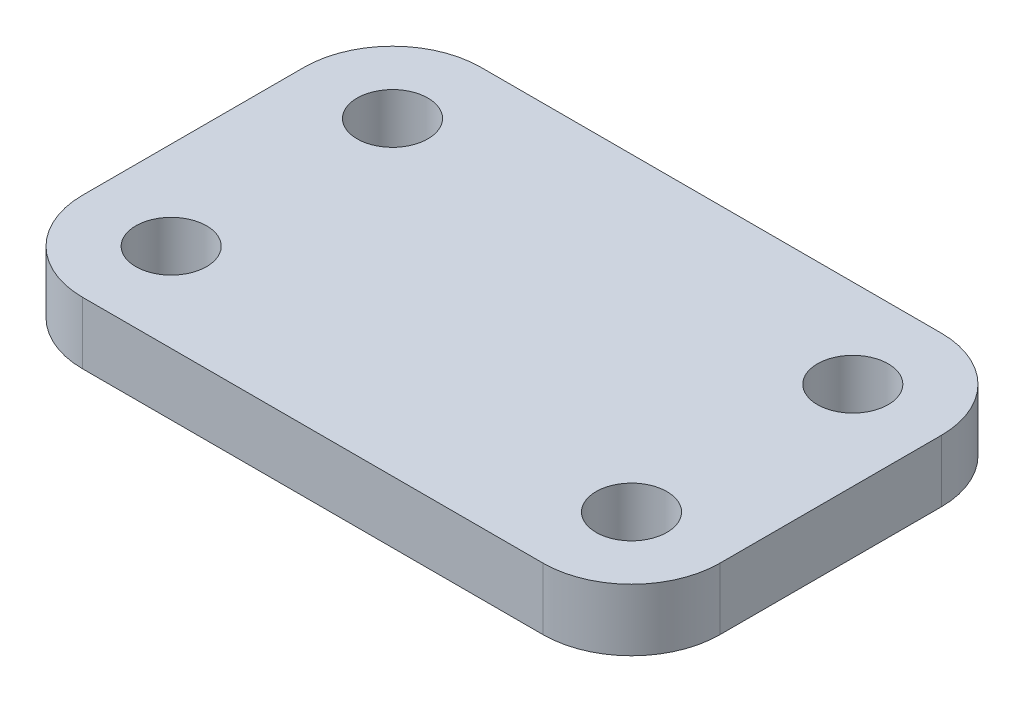
ISO-10303-21;
HEADER;
FILE_DESCRIPTION(('STEP AP214'),'2;1');
FILE_NAME('part.step','',(''),(''),'','','');
FILE_SCHEMA(('AUTOMOTIVE_DESIGN { 1 0 10303 214 1 1 1 1 }'));
ENDSEC;
DATA;
#1=APPLICATION_CONTEXT('core data for automotive mechanical design processes');
#2=APPLICATION_PROTOCOL_DEFINITION('international standard','automotive_design',2000,#1);
#3=PRODUCT_CONTEXT('',#1,'mechanical');
#4=PRODUCT('Part','Part','',(#3));
#5=PRODUCT_RELATED_PRODUCT_CATEGORY('part','',(#4));
#6=PRODUCT_DEFINITION_FORMATION('','',#4);
#7=PRODUCT_DEFINITION_CONTEXT('part definition',#1,'design');
#8=PRODUCT_DEFINITION('design','',#6,#7);
#9=PRODUCT_DEFINITION_SHAPE('','',#8);
#10=(LENGTH_UNIT() NAMED_UNIT(*) SI_UNIT(.MILLI.,.METRE.));
#11=(NAMED_UNIT(*) PLANE_ANGLE_UNIT() SI_UNIT($,.RADIAN.));
#12=(NAMED_UNIT(*) SI_UNIT($,.STERADIAN.) SOLID_ANGLE_UNIT());
#13=UNCERTAINTY_MEASURE_WITH_UNIT(LENGTH_MEASURE(1.E-05),#10,'distance_accuracy_value','');
#14=(GEOMETRIC_REPRESENTATION_CONTEXT(3) GLOBAL_UNCERTAINTY_ASSIGNED_CONTEXT((#13)) GLOBAL_UNIT_ASSIGNED_CONTEXT((#10,
#11,#12)) REPRESENTATION_CONTEXT('',''));
#15=CARTESIAN_POINT('',(0.,0.,0.));
#16=DIRECTION('',(0.,0.,1.));
#17=DIRECTION('',(1.,0.,0.));
#18=AXIS2_PLACEMENT_3D('',#15,#16,#17);
#19=CARTESIAN_POINT('',(36.,7.,-22.5));
#20=DIRECTION('',(-1.,0.,0.));
#21=DIRECTION('',(0.,0.,1.));
#22=AXIS2_PLACEMENT_3D('',#19,#20,#21);
#23=PLANE('',#22);
#24=DIRECTION('',(0.,0.,-1.));
#25=VECTOR('',#24,1.);
#26=CARTESIAN_POINT('',(36.,0.,-22.5));
#27=LINE('',#26,#25);
#28=CARTESIAN_POINT('',(36.,0.,12.5));
#29=VERTEX_POINT('',#28);
#30=CARTESIAN_POINT('',(36.,0.,-12.5));
#31=VERTEX_POINT('',#30);
#32=EDGE_CURVE('E119',#29,#31,#27,.T.);
#33=ORIENTED_EDGE('',*,*,#32,.T.);
#34=DIRECTION('',(0.,-1.,0.));
#35=VECTOR('',#34,1.);
#36=CARTESIAN_POINT('',(36.,7.,-12.5));
#37=LINE('',#36,#35);
#38=CARTESIAN_POINT('',(36.,7.,-12.5));
#39=VERTEX_POINT('',#38);
#40=EDGE_CURVE('E11',#31,#39,#37,.F.);
#41=ORIENTED_EDGE('',*,*,#40,.T.);
#42=DIRECTION('',(0.,0.,-1.));
#43=VECTOR('',#42,1.);
#44=CARTESIAN_POINT('',(36.,7.,-22.5));
#45=LINE('',#44,#43);
#46=CARTESIAN_POINT('',(36.,7.,12.5));
#47=VERTEX_POINT('',#46);
#48=EDGE_CURVE('E120',#47,#39,#45,.T.);
#49=ORIENTED_EDGE('',*,*,#48,.F.);
#50=DIRECTION('',(0.,-1.,0.));
#51=VECTOR('',#50,1.);
#52=CARTESIAN_POINT('',(36.,7.,12.5));
#53=LINE('',#52,#51);
#54=EDGE_CURVE('E111',#47,#29,#53,.T.);
#55=ORIENTED_EDGE('',*,*,#54,.T.);
#56=EDGE_LOOP('',(#33,#41,#49,#55));
#57=FACE_BOUND('',#56,.T.);
#58=ADVANCED_FACE('F39',(#57),#23,.F.);
#59=CARTESIAN_POINT('',(-36.,7.,-22.5));
#60=DIRECTION('',(0.,0.,1.));
#61=DIRECTION('',(1.,0.,0.));
#62=AXIS2_PLACEMENT_3D('',#59,#60,#61);
#63=PLANE('',#62);
#64=DIRECTION('',(-1.,0.,0.));
#65=VECTOR('',#64,1.);
#66=CARTESIAN_POINT('',(-36.,0.,-22.5));
#67=LINE('',#66,#65);
#68=CARTESIAN_POINT('',(26.,0.,-22.5));
#69=VERTEX_POINT('',#68);
#70=CARTESIAN_POINT('',(-26.,0.,-22.5));
#71=VERTEX_POINT('',#70);
#72=EDGE_CURVE('E129',#69,#71,#67,.T.);
#73=ORIENTED_EDGE('',*,*,#72,.T.);
#74=DIRECTION('',(0.,-1.,0.));
#75=VECTOR('',#74,1.);
#76=CARTESIAN_POINT('',(-26.,7.,-22.5));
#77=LINE('',#76,#75);
#78=CARTESIAN_POINT('',(-26.,7.,-22.5));
#79=VERTEX_POINT('',#78);
#80=EDGE_CURVE('E173',#71,#79,#77,.F.);
#81=ORIENTED_EDGE('',*,*,#80,.T.);
#82=DIRECTION('',(-1.,0.,0.));
#83=VECTOR('',#82,1.);
#84=CARTESIAN_POINT('',(-36.,7.,-22.5));
#85=LINE('',#84,#83);
#86=CARTESIAN_POINT('',(26.,7.,-22.5));
#87=VERTEX_POINT('',#86);
#88=EDGE_CURVE('E315',#87,#79,#85,.T.);
#89=ORIENTED_EDGE('',*,*,#88,.F.);
#90=DIRECTION('',(0.,-1.,0.));
#91=VECTOR('',#90,1.);
#92=CARTESIAN_POINT('',(26.,7.,-22.5));
#93=LINE('',#92,#91);
#94=EDGE_CURVE('E169',#87,#69,#93,.T.);
#95=ORIENTED_EDGE('',*,*,#94,.T.);
#96=EDGE_LOOP('',(#73,#81,#89,#95));
#97=FACE_BOUND('',#96,.T.);
#98=ADVANCED_FACE('F206',(#97),#63,.F.);
#99=CARTESIAN_POINT('',(-36.,7.,-22.5));
#100=DIRECTION('',(1.,0.,0.));
#101=DIRECTION('',(0.,0.,-1.));
#102=AXIS2_PLACEMENT_3D('',#99,#100,#101);
#103=PLANE('',#102);
#104=DIRECTION('',(0.,0.,1.));
#105=VECTOR('',#104,1.);
#106=CARTESIAN_POINT('',(-36.,7.,-22.5));
#107=LINE('',#106,#105);
#108=CARTESIAN_POINT('',(-36.,7.,-12.5));
#109=VERTEX_POINT('',#108);
#110=CARTESIAN_POINT('',(-36.,7.,12.5));
#111=VERTEX_POINT('',#110);
#112=EDGE_CURVE('E318',#109,#111,#107,.T.);
#113=ORIENTED_EDGE('',*,*,#112,.F.);
#114=DIRECTION('',(0.,-1.,0.));
#115=VECTOR('',#114,1.);
#116=CARTESIAN_POINT('',(-36.,7.,-12.5));
#117=LINE('',#116,#115);
#118=CARTESIAN_POINT('',(-36.,0.,-12.5));
#119=VERTEX_POINT('',#118);
#120=EDGE_CURVE('E157',#109,#119,#117,.T.);
#121=ORIENTED_EDGE('',*,*,#120,.T.);
#122=DIRECTION('',(0.,0.,1.));
#123=VECTOR('',#122,1.);
#124=CARTESIAN_POINT('',(-36.,0.,-22.5));
#125=LINE('',#124,#123);
#126=CARTESIAN_POINT('',(-36.,0.,12.5));
#127=VERTEX_POINT('',#126);
#128=EDGE_CURVE('E135',#119,#127,#125,.T.);
#129=ORIENTED_EDGE('',*,*,#128,.T.);
#130=DIRECTION('',(0.,-1.,0.));
#131=VECTOR('',#130,1.);
#132=CARTESIAN_POINT('',(-36.,7.,12.5));
#133=LINE('',#132,#131);
#134=EDGE_CURVE('E154',#127,#111,#133,.F.);
#135=ORIENTED_EDGE('',*,*,#134,.T.);
#136=EDGE_LOOP('',(#113,#121,#129,#135));
#137=FACE_BOUND('',#136,.T.);
#138=ADVANCED_FACE('F192',(#137),#103,.F.);
#139=CARTESIAN_POINT('',(-36.,7.,22.5));
#140=DIRECTION('',(0.,0.,-1.));
#141=DIRECTION('',(-1.,0.,0.));
#142=AXIS2_PLACEMENT_3D('',#139,#140,#141);
#143=PLANE('',#142);
#144=DIRECTION('',(1.,0.,0.));
#145=VECTOR('',#144,1.);
#146=CARTESIAN_POINT('',(-36.,7.,22.5));
#147=LINE('',#146,#145);
#148=CARTESIAN_POINT('',(-26.,7.,22.5));
#149=VERTEX_POINT('',#148);
#150=CARTESIAN_POINT('',(26.,7.,22.5));
#151=VERTEX_POINT('',#150);
#152=EDGE_CURVE('E122',#149,#151,#147,.T.);
#153=ORIENTED_EDGE('',*,*,#152,.F.);
#154=DIRECTION('',(0.,-1.,0.));
#155=VECTOR('',#154,1.);
#156=CARTESIAN_POINT('',(-26.,7.,22.5));
#157=LINE('',#156,#155);
#158=CARTESIAN_POINT('',(-26.,0.,22.5));
#159=VERTEX_POINT('',#158);
#160=EDGE_CURVE('E48',#149,#159,#157,.T.);
#161=ORIENTED_EDGE('',*,*,#160,.T.);
#162=DIRECTION('',(1.,0.,0.));
#163=VECTOR('',#162,1.);
#164=CARTESIAN_POINT('',(-36.,0.,22.5));
#165=LINE('',#164,#163);
#166=CARTESIAN_POINT('',(26.,0.,22.5));
#167=VERTEX_POINT('',#166);
#168=EDGE_CURVE('E146',#159,#167,#165,.T.);
#169=ORIENTED_EDGE('',*,*,#168,.T.);
#170=DIRECTION('',(0.,-1.,0.));
#171=VECTOR('',#170,1.);
#172=CARTESIAN_POINT('',(26.,7.,22.5));
#173=LINE('',#172,#171);
#174=EDGE_CURVE('E113',#167,#151,#173,.F.);
#175=ORIENTED_EDGE('',*,*,#174,.T.);
#176=EDGE_LOOP('',(#153,#161,#169,#175));
#177=FACE_BOUND('',#176,.T.);
#178=ADVANCED_FACE('F187',(#177),#143,.F.);
#179=CARTESIAN_POINT('',(0.,7.,0.));
#180=DIRECTION('',(0.,1.,0.));
#181=DIRECTION('',(0.,0.,1.));
#182=AXIS2_PLACEMENT_3D('',#179,#180,#181);
#183=PLANE('',#182);
#184=CARTESIAN_POINT('',(26.,7.,-12.5));
#185=DIRECTION('',(0.,1.,0.));
#186=DIRECTION('',(0.,0.,1.));
#187=AXIS2_PLACEMENT_3D('',#184,#185,#186);
#188=CIRCLE('',#187,4.);
#189=CARTESIAN_POINT('',(26.,7.,-8.5));
#190=VERTEX_POINT('',#189);
#191=EDGE_CURVE('E301',#190,#190,#188,.T.);
#192=ORIENTED_EDGE('',*,*,#191,.F.);
#193=EDGE_LOOP('',(#192));
#194=FACE_BOUND('',#193,.T.);
#195=CARTESIAN_POINT('',(-26.,7.,12.5));
#196=DIRECTION('',(0.,1.,0.));
#197=DIRECTION('',(0.,0.,1.));
#198=AXIS2_PLACEMENT_3D('',#195,#196,#197);
#199=CIRCLE('',#198,4.);
#200=CARTESIAN_POINT('',(-26.,7.,16.5));
#201=VERTEX_POINT('',#200);
#202=EDGE_CURVE('E305',#201,#201,#199,.T.);
#203=ORIENTED_EDGE('',*,*,#202,.F.);
#204=EDGE_LOOP('',(#203));
#205=FACE_BOUND('',#204,.T.);
#206=CARTESIAN_POINT('',(26.,7.,12.5));
#207=DIRECTION('',(0.,1.,0.));
#208=DIRECTION('',(0.,0.,1.));
#209=AXIS2_PLACEMENT_3D('',#206,#207,#208);
#210=CIRCLE('',#209,4.);
#211=CARTESIAN_POINT('',(26.,7.,16.5));
#212=VERTEX_POINT('',#211);
#213=EDGE_CURVE('E330',#212,#212,#210,.T.);
#214=ORIENTED_EDGE('',*,*,#213,.F.);
#215=EDGE_LOOP('',(#214));
#216=FACE_BOUND('',#215,.T.);
#217=CARTESIAN_POINT('',(-26.,7.,-12.5));
#218=DIRECTION('',(0.,1.,0.));
#219=DIRECTION('',(0.,0.,1.));
#220=AXIS2_PLACEMENT_3D('',#217,#218,#219);
#221=CIRCLE('',#220,4.);
#222=CARTESIAN_POINT('',(-26.,7.,-8.5));
#223=VERTEX_POINT('',#222);
#224=EDGE_CURVE('E138',#223,#223,#221,.T.);
#225=ORIENTED_EDGE('',*,*,#224,.F.);
#226=EDGE_LOOP('',(#225));
#227=FACE_BOUND('',#226,.T.);
#228=ORIENTED_EDGE('',*,*,#88,.T.);
#229=CARTESIAN_POINT('',(-26.,7.,-12.5));
#230=DIRECTION('',(0.,1.,0.));
#231=DIRECTION('',(0.,0.,1.));
#232=AXIS2_PLACEMENT_3D('',#229,#230,#231);
#233=CIRCLE('',#232,10.);
#234=EDGE_CURVE('E181',#79,#109,#233,.T.);
#235=ORIENTED_EDGE('',*,*,#234,.T.);
#236=ORIENTED_EDGE('',*,*,#112,.T.);
#237=CARTESIAN_POINT('',(-26.,7.,12.5));
#238=DIRECTION('',(0.,1.,0.));
#239=DIRECTION('',(0.,0.,1.));
#240=AXIS2_PLACEMENT_3D('',#237,#238,#239);
#241=CIRCLE('',#240,10.);
#242=EDGE_CURVE('E61',#111,#149,#241,.T.);
#243=ORIENTED_EDGE('',*,*,#242,.T.);
#244=ORIENTED_EDGE('',*,*,#152,.T.);
#245=CARTESIAN_POINT('',(26.,7.,12.5));
#246=DIRECTION('',(0.,1.,0.));
#247=DIRECTION('',(0.,0.,1.));
#248=AXIS2_PLACEMENT_3D('',#245,#246,#247);
#249=CIRCLE('',#248,10.);
#250=EDGE_CURVE('E151',#151,#47,#249,.T.);
#251=ORIENTED_EDGE('',*,*,#250,.T.);
#252=ORIENTED_EDGE('',*,*,#48,.T.);
#253=CARTESIAN_POINT('',(26.,7.,-12.5));
#254=DIRECTION('',(0.,1.,0.));
#255=DIRECTION('',(0.,0.,1.));
#256=AXIS2_PLACEMENT_3D('',#253,#254,#255);
#257=CIRCLE('',#256,10.);
#258=EDGE_CURVE('E176',#39,#87,#257,.T.);
#259=ORIENTED_EDGE('',*,*,#258,.T.);
#260=EDGE_LOOP('',(#228,#235,#236,#243,#244,#251,#252,#259));
#261=FACE_BOUND('',#260,.T.);
#262=ADVANCED_FACE('F219',(#194,#205,#216,#227,#261),#183,.T.);
#263=CARTESIAN_POINT('',(0.,0.,0.));
#264=DIRECTION('',(0.,1.,0.));
#265=DIRECTION('',(0.,0.,1.));
#266=AXIS2_PLACEMENT_3D('',#263,#264,#265);
#267=PLANE('',#266);
#268=CARTESIAN_POINT('',(26.,0.,-12.5));
#269=DIRECTION('',(0.,1.,0.));
#270=DIRECTION('',(0.,0.,1.));
#271=AXIS2_PLACEMENT_3D('',#268,#269,#270);
#272=CIRCLE('',#271,4.);
#273=CARTESIAN_POINT('',(26.,0.,-8.5));
#274=VERTEX_POINT('',#273);
#275=EDGE_CURVE('E298',#274,#274,#272,.T.);
#276=ORIENTED_EDGE('',*,*,#275,.T.);
#277=EDGE_LOOP('',(#276));
#278=FACE_BOUND('',#277,.T.);
#279=CARTESIAN_POINT('',(-26.,0.,12.5));
#280=DIRECTION('',(0.,1.,0.));
#281=DIRECTION('',(0.,0.,1.));
#282=AXIS2_PLACEMENT_3D('',#279,#280,#281);
#283=CIRCLE('',#282,4.);
#284=CARTESIAN_POINT('',(-26.,0.,16.5));
#285=VERTEX_POINT('',#284);
#286=EDGE_CURVE('E336',#285,#285,#283,.T.);
#287=ORIENTED_EDGE('',*,*,#286,.T.);
#288=EDGE_LOOP('',(#287));
#289=FACE_BOUND('',#288,.T.);
#290=CARTESIAN_POINT('',(26.,0.,12.5));
#291=DIRECTION('',(0.,1.,0.));
#292=DIRECTION('',(0.,0.,1.));
#293=AXIS2_PLACEMENT_3D('',#290,#291,#292);
#294=CIRCLE('',#293,4.);
#295=CARTESIAN_POINT('',(26.,0.,16.5));
#296=VERTEX_POINT('',#295);
#297=EDGE_CURVE('E312',#296,#296,#294,.T.);
#298=ORIENTED_EDGE('',*,*,#297,.T.);
#299=EDGE_LOOP('',(#298));
#300=FACE_BOUND('',#299,.T.);
#301=CARTESIAN_POINT('',(-26.,0.,-12.5));
#302=DIRECTION('',(0.,1.,0.));
#303=DIRECTION('',(0.,0.,1.));
#304=AXIS2_PLACEMENT_3D('',#301,#302,#303);
#305=CIRCLE('',#304,4.);
#306=CARTESIAN_POINT('',(-26.,0.,-8.5));
#307=VERTEX_POINT('',#306);
#308=EDGE_CURVE('E130',#307,#307,#305,.T.);
#309=ORIENTED_EDGE('',*,*,#308,.T.);
#310=EDGE_LOOP('',(#309));
#311=FACE_BOUND('',#310,.T.);
#312=ORIENTED_EDGE('',*,*,#128,.F.);
#313=CARTESIAN_POINT('',(-26.,0.,-12.5));
#314=DIRECTION('',(0.,1.,0.));
#315=DIRECTION('',(0.,0.,1.));
#316=AXIS2_PLACEMENT_3D('',#313,#314,#315);
#317=CIRCLE('',#316,10.);
#318=EDGE_CURVE('E166',#119,#71,#317,.F.);
#319=ORIENTED_EDGE('',*,*,#318,.T.);
#320=ORIENTED_EDGE('',*,*,#72,.F.);
#321=CARTESIAN_POINT('',(26.,0.,-12.5));
#322=DIRECTION('',(0.,1.,0.));
#323=DIRECTION('',(0.,0.,1.));
#324=AXIS2_PLACEMENT_3D('',#321,#322,#323);
#325=CIRCLE('',#324,10.);
#326=EDGE_CURVE('E127',#69,#31,#325,.F.);
#327=ORIENTED_EDGE('',*,*,#326,.T.);
#328=ORIENTED_EDGE('',*,*,#32,.F.);
#329=CARTESIAN_POINT('',(26.,0.,12.5));
#330=DIRECTION('',(0.,1.,0.));
#331=DIRECTION('',(0.,0.,1.));
#332=AXIS2_PLACEMENT_3D('',#329,#330,#331);
#333=CIRCLE('',#332,10.);
#334=EDGE_CURVE('E107',#29,#167,#333,.F.);
#335=ORIENTED_EDGE('',*,*,#334,.T.);
#336=ORIENTED_EDGE('',*,*,#168,.F.);
#337=CARTESIAN_POINT('',(-26.,0.,12.5));
#338=DIRECTION('',(0.,1.,0.));
#339=DIRECTION('',(0.,0.,1.));
#340=AXIS2_PLACEMENT_3D('',#337,#338,#339);
#341=CIRCLE('',#340,10.);
#342=EDGE_CURVE('E163',#159,#127,#341,.F.);
#343=ORIENTED_EDGE('',*,*,#342,.T.);
#344=EDGE_LOOP('',(#312,#319,#320,#327,#328,#335,#336,#343));
#345=FACE_BOUND('',#344,.T.);
#346=ADVANCED_FACE('F125',(#278,#289,#300,#311,#345),#267,.F.);
#347=CARTESIAN_POINT('',(26.,7.,12.5));
#348=DIRECTION('',(0.,-1.,0.));
#349=DIRECTION('',(0.,0.,-1.));
#350=AXIS2_PLACEMENT_3D('',#347,#348,#349);
#351=CYLINDRICAL_SURFACE('',#350,10.);
#352=ORIENTED_EDGE('',*,*,#250,.F.);
#353=ORIENTED_EDGE('',*,*,#174,.F.);
#354=ORIENTED_EDGE('',*,*,#334,.F.);
#355=ORIENTED_EDGE('',*,*,#54,.F.);
#356=EDGE_LOOP('',(#352,#353,#354,#355));
#357=FACE_BOUND('',#356,.T.);
#358=ADVANCED_FACE('F110',(#357),#351,.T.);
#359=CARTESIAN_POINT('',(-26.,7.,-12.5));
#360=DIRECTION('',(0.,-1.,0.));
#361=DIRECTION('',(0.,0.,-1.));
#362=AXIS2_PLACEMENT_3D('',#359,#360,#361);
#363=CYLINDRICAL_SURFACE('',#362,10.);
#364=ORIENTED_EDGE('',*,*,#234,.F.);
#365=ORIENTED_EDGE('',*,*,#80,.F.);
#366=ORIENTED_EDGE('',*,*,#318,.F.);
#367=ORIENTED_EDGE('',*,*,#120,.F.);
#368=EDGE_LOOP('',(#364,#365,#366,#367));
#369=FACE_BOUND('',#368,.T.);
#370=ADVANCED_FACE('F196',(#369),#363,.T.);
#371=CARTESIAN_POINT('',(-26.,7.,12.5));
#372=DIRECTION('',(0.,-1.,0.));
#373=DIRECTION('',(0.,0.,-1.));
#374=AXIS2_PLACEMENT_3D('',#371,#372,#373);
#375=CYLINDRICAL_SURFACE('',#374,10.);
#376=ORIENTED_EDGE('',*,*,#242,.F.);
#377=ORIENTED_EDGE('',*,*,#134,.F.);
#378=ORIENTED_EDGE('',*,*,#342,.F.);
#379=ORIENTED_EDGE('',*,*,#160,.F.);
#380=EDGE_LOOP('',(#376,#377,#378,#379));
#381=FACE_BOUND('',#380,.T.);
#382=ADVANCED_FACE('F194',(#381),#375,.T.);
#383=CARTESIAN_POINT('',(26.,7.,-12.5));
#384=DIRECTION('',(0.,-1.,0.));
#385=DIRECTION('',(0.,0.,-1.));
#386=AXIS2_PLACEMENT_3D('',#383,#384,#385);
#387=CYLINDRICAL_SURFACE('',#386,10.);
#388=ORIENTED_EDGE('',*,*,#258,.F.);
#389=ORIENTED_EDGE('',*,*,#40,.F.);
#390=ORIENTED_EDGE('',*,*,#326,.F.);
#391=ORIENTED_EDGE('',*,*,#94,.F.);
#392=EDGE_LOOP('',(#388,#389,#390,#391));
#393=FACE_BOUND('',#392,.T.);
#394=ADVANCED_FACE('F41',(#393),#387,.T.);
#395=CARTESIAN_POINT('',(-26.,0.,-12.5));
#396=DIRECTION('',(0.,1.,0.));
#397=DIRECTION('',(0.,0.,1.));
#398=AXIS2_PLACEMENT_3D('',#395,#396,#397);
#399=CYLINDRICAL_SURFACE('',#398,4.);
#400=ORIENTED_EDGE('',*,*,#308,.F.);
#401=EDGE_LOOP('',(#400));
#402=FACE_BOUND('',#401,.T.);
#403=ORIENTED_EDGE('',*,*,#224,.T.);
#404=EDGE_LOOP('',(#403));
#405=FACE_BOUND('',#404,.T.);
#406=ADVANCED_FACE('F201',(#402,#405),#399,.F.);
#407=CARTESIAN_POINT('',(26.,0.,12.5));
#408=DIRECTION('',(0.,1.,0.));
#409=DIRECTION('',(0.,0.,1.));
#410=AXIS2_PLACEMENT_3D('',#407,#408,#409);
#411=CYLINDRICAL_SURFACE('',#410,4.);
#412=ORIENTED_EDGE('',*,*,#297,.F.);
#413=EDGE_LOOP('',(#412));
#414=FACE_BOUND('',#413,.T.);
#415=ORIENTED_EDGE('',*,*,#213,.T.);
#416=EDGE_LOOP('',(#415));
#417=FACE_BOUND('',#416,.T.);
#418=ADVANCED_FACE('F263',(#414,#417),#411,.F.);
#419=CARTESIAN_POINT('',(-26.,0.,12.5));
#420=DIRECTION('',(0.,1.,0.));
#421=DIRECTION('',(0.,0.,1.));
#422=AXIS2_PLACEMENT_3D('',#419,#420,#421);
#423=CYLINDRICAL_SURFACE('',#422,4.);
#424=ORIENTED_EDGE('',*,*,#286,.F.);
#425=EDGE_LOOP('',(#424));
#426=FACE_BOUND('',#425,.T.);
#427=ORIENTED_EDGE('',*,*,#202,.T.);
#428=EDGE_LOOP('',(#427));
#429=FACE_BOUND('',#428,.T.);
#430=ADVANCED_FACE('F272',(#426,#429),#423,.F.);
#431=CARTESIAN_POINT('',(26.,0.,-12.5));
#432=DIRECTION('',(0.,1.,0.));
#433=DIRECTION('',(0.,0.,1.));
#434=AXIS2_PLACEMENT_3D('',#431,#432,#433);
#435=CYLINDRICAL_SURFACE('',#434,4.);
#436=ORIENTED_EDGE('',*,*,#275,.F.);
#437=EDGE_LOOP('',(#436));
#438=FACE_BOUND('',#437,.T.);
#439=ORIENTED_EDGE('',*,*,#191,.T.);
#440=EDGE_LOOP('',(#439));
#441=FACE_BOUND('',#440,.T.);
#442=ADVANCED_FACE('F282',(#438,#441),#435,.F.);
#443=CLOSED_SHELL('',(#58,#98,#138,#178,#262,#346,#358,#370,#382,#394,#406,#418,#430,#442));
#444=MANIFOLD_SOLID_BREP('B2',#443);
#445=ADVANCED_BREP_SHAPE_REPRESENTATION('',(#18,#444),#14);
#446=SHAPE_DEFINITION_REPRESENTATION(#9,#445);
ENDSEC;
END-ISO-10303-21;
